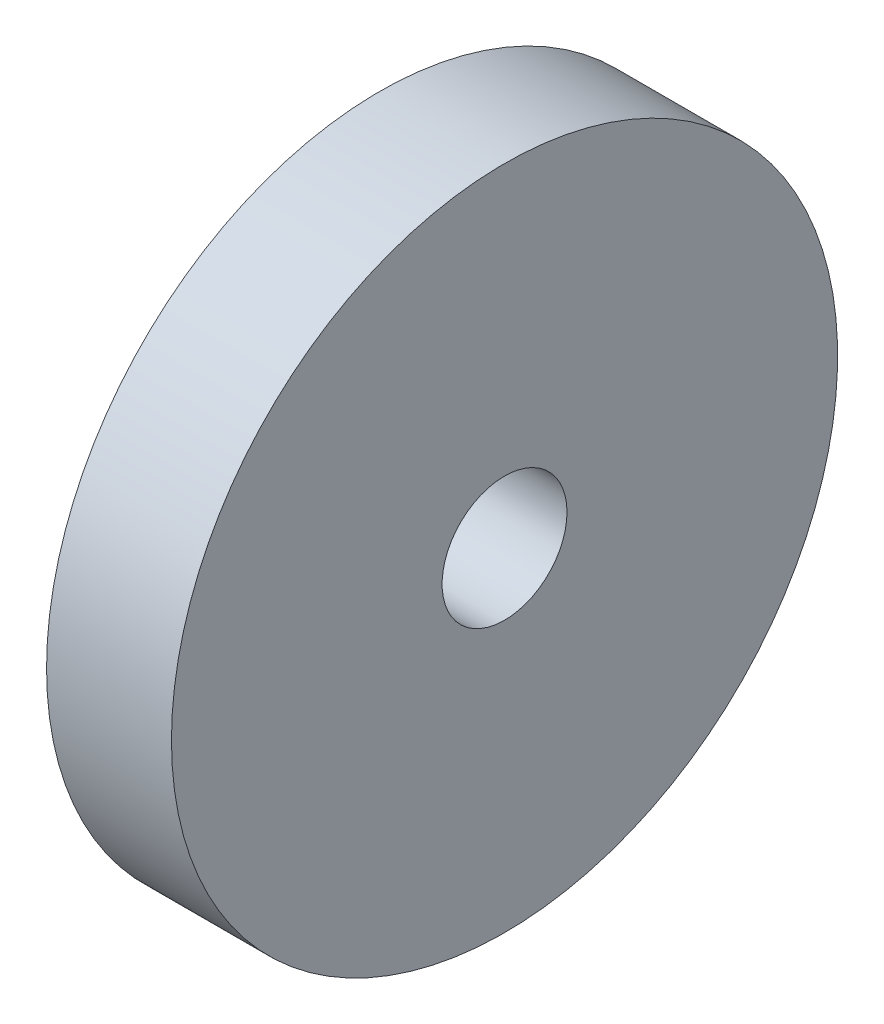
ISO-10303-21;
HEADER;
FILE_DESCRIPTION(('STEP AP214'),'2;1');
FILE_NAME('part.step','',(''),(''),'','','');
FILE_SCHEMA(('AUTOMOTIVE_DESIGN { 1 0 10303 214 1 1 1 1 }'));
ENDSEC;
DATA;
#1=APPLICATION_CONTEXT('core data for automotive mechanical design processes');
#2=APPLICATION_PROTOCOL_DEFINITION('international standard','automotive_design',2000,#1);
#3=PRODUCT_CONTEXT('',#1,'mechanical');
#4=PRODUCT('Part','Part','',(#3));
#5=PRODUCT_RELATED_PRODUCT_CATEGORY('part','',(#4));
#6=PRODUCT_DEFINITION_FORMATION('','',#4);
#7=PRODUCT_DEFINITION_CONTEXT('part definition',#1,'design');
#8=PRODUCT_DEFINITION('design','',#6,#7);
#9=PRODUCT_DEFINITION_SHAPE('','',#8);
#10=(LENGTH_UNIT() NAMED_UNIT(*) SI_UNIT(.MILLI.,.METRE.));
#11=(NAMED_UNIT(*) PLANE_ANGLE_UNIT() SI_UNIT($,.RADIAN.));
#12=(NAMED_UNIT(*) SI_UNIT($,.STERADIAN.) SOLID_ANGLE_UNIT());
#13=UNCERTAINTY_MEASURE_WITH_UNIT(LENGTH_MEASURE(1.E-05),#10,'distance_accuracy_value','');
#14=(GEOMETRIC_REPRESENTATION_CONTEXT(3) GLOBAL_UNCERTAINTY_ASSIGNED_CONTEXT((#13)) GLOBAL_UNIT_ASSIGNED_CONTEXT((#10,
#11,#12)) REPRESENTATION_CONTEXT('',''));
#15=CARTESIAN_POINT('',(0.,0.,0.));
#16=DIRECTION('',(0.,0.,1.));
#17=DIRECTION('',(1.,0.,0.));
#18=AXIS2_PLACEMENT_3D('',#15,#16,#17);
#19=CARTESIAN_POINT('',(9.525,0.,0.));
#20=DIRECTION('',(-1.,0.,0.));
#21=DIRECTION('',(0.,0.,1.));
#22=AXIS2_PLACEMENT_3D('',#19,#20,#21);
#23=CYLINDRICAL_SURFACE('',#22,12.7);
#24=CARTESIAN_POINT('',(9.525,0.,0.));
#25=DIRECTION('',(1.,0.,0.));
#26=DIRECTION('',(0.,0.,-1.));
#27=AXIS2_PLACEMENT_3D('',#24,#25,#26);
#28=CIRCLE('',#27,12.7);
#29=CARTESIAN_POINT('',(9.525,0.,12.7));
#30=VERTEX_POINT('',#29);
#31=EDGE_CURVE('E10',#30,#30,#28,.T.);
#32=CARTESIAN_POINT('',(4.7625,0.,0.));
#33=DIRECTION('',(1.,0.,0.));
#34=DIRECTION('',(0.,0.,-1.));
#35=AXIS2_PLACEMENT_3D('',#32,#33,#34);
#36=CIRCLE('',#35,12.7);
#37=CARTESIAN_POINT('',(4.7625,0.,12.7));
#38=VERTEX_POINT('',#37);
#39=EDGE_CURVE('E37',#38,#38,#36,.T.);
#40=CARTESIAN_POINT('',(9.525,0.,12.7));
#41=CARTESIAN_POINT('',(9.475390625,0.,12.7));
#42=CARTESIAN_POINT('',(9.42578125,0.,12.7));
#43=CARTESIAN_POINT('',(9.3265625,0.,12.7));
#44=CARTESIAN_POINT('',(9.276953125,0.,12.7));
#45=CARTESIAN_POINT('',(9.177734375,0.,12.7));
#46=CARTESIAN_POINT('',(9.128125,0.,12.7));
#47=CARTESIAN_POINT('',(9.02890625,0.,12.7));
#48=CARTESIAN_POINT('',(8.979296875,0.,12.7));
#49=CARTESIAN_POINT('',(8.880078125,0.,12.7));
#50=CARTESIAN_POINT('',(8.83046875,0.,12.7));
#51=CARTESIAN_POINT('',(8.73125,0.,12.7));
#52=CARTESIAN_POINT('',(8.681640625,0.,12.7));
#53=CARTESIAN_POINT('',(8.582421875,0.,12.7));
#54=CARTESIAN_POINT('',(8.5328125,0.,12.7));
#55=CARTESIAN_POINT('',(8.43359375,0.,12.7));
#56=CARTESIAN_POINT('',(8.383984375,0.,12.7));
#57=CARTESIAN_POINT('',(8.284765625,0.,12.7));
#58=CARTESIAN_POINT('',(8.23515625,0.,12.7));
#59=CARTESIAN_POINT('',(8.1359375,0.,12.7));
#60=CARTESIAN_POINT('',(8.086328125,0.,12.7));
#61=CARTESIAN_POINT('',(7.987109375,0.,12.7));
#62=CARTESIAN_POINT('',(7.9375,0.,12.7));
#63=CARTESIAN_POINT('',(7.83828125,0.,12.7));
#64=CARTESIAN_POINT('',(7.788671875,0.,12.7));
#65=CARTESIAN_POINT('',(7.689453125,0.,12.7));
#66=CARTESIAN_POINT('',(7.63984375,0.,12.7));
#67=CARTESIAN_POINT('',(7.540625,0.,12.7));
#68=CARTESIAN_POINT('',(7.491015625,0.,12.7));
#69=CARTESIAN_POINT('',(7.391796875,0.,12.7));
#70=CARTESIAN_POINT('',(7.3421875,0.,12.7));
#71=CARTESIAN_POINT('',(7.24296875,0.,12.7));
#72=CARTESIAN_POINT('',(7.193359375,0.,12.7));
#73=CARTESIAN_POINT('',(7.094140625,0.,12.7));
#74=CARTESIAN_POINT('',(7.04453125,0.,12.7));
#75=CARTESIAN_POINT('',(6.9453125,0.,12.7));
#76=CARTESIAN_POINT('',(6.895703125,0.,12.7));
#77=CARTESIAN_POINT('',(6.796484375,0.,12.7));
#78=CARTESIAN_POINT('',(6.746875,0.,12.7));
#79=CARTESIAN_POINT('',(6.64765625,0.,12.7));
#80=CARTESIAN_POINT('',(6.598046875,0.,12.7));
#81=CARTESIAN_POINT('',(6.498828125,0.,12.7));
#82=CARTESIAN_POINT('',(6.44921875,0.,12.7));
#83=CARTESIAN_POINT('',(6.35,0.,12.7));
#84=CARTESIAN_POINT('',(6.300390625,0.,12.7));
#85=CARTESIAN_POINT('',(6.201171875,0.,12.7));
#86=CARTESIAN_POINT('',(6.1515625,0.,12.7));
#87=CARTESIAN_POINT('',(6.05234375,0.,12.7));
#88=CARTESIAN_POINT('',(6.002734375,0.,12.7));
#89=CARTESIAN_POINT('',(5.903515625,0.,12.7));
#90=CARTESIAN_POINT('',(5.85390625,0.,12.7));
#91=CARTESIAN_POINT('',(5.7546875,0.,12.7));
#92=CARTESIAN_POINT('',(5.705078125,0.,12.7));
#93=CARTESIAN_POINT('',(5.605859375,0.,12.7));
#94=CARTESIAN_POINT('',(5.55625,0.,12.7));
#95=CARTESIAN_POINT('',(5.45703125,0.,12.7));
#96=CARTESIAN_POINT('',(5.407421875,0.,12.7));
#97=CARTESIAN_POINT('',(5.308203125,0.,12.7));
#98=CARTESIAN_POINT('',(5.25859375,0.,12.7));
#99=CARTESIAN_POINT('',(5.159375,0.,12.7));
#100=CARTESIAN_POINT('',(5.109765625,0.,12.7));
#101=CARTESIAN_POINT('',(5.010546875,0.,12.7));
#102=CARTESIAN_POINT('',(4.9609375,0.,12.7));
#103=CARTESIAN_POINT('',(4.86171875,0.,12.7));
#104=CARTESIAN_POINT('',(4.812109375,0.,12.7));
#105=CARTESIAN_POINT('',(4.7625,0.,12.7));
#106=B_SPLINE_CURVE_WITH_KNOTS('',3,(#40,#41,#42,#43,#44,#45,#46,#47,#48,#49,#50,#51,#52,#53,
#54,#55,#56,#57,#58,#59,#60,#61,#62,#63,#64,#65,#66,#67,#68,#69,#70,#71,#72,#73,#74,#75,#76,#77,
#78,#79,#80,#81,#82,#83,#84,#85,#86,#87,#88,#89,#90,#91,#92,#93,#94,#95,#96,#97,#98,#99,#100,
#101,#102,#103,#104,#105),.UNSPECIFIED.,.F.,.F.,(4,2,2,2,2,2,2,2,2,2,2,2,2,2,2,2,2,2,2,2,2,2,2,
2,2,2,2,2,2,2,2,2,4),(0.,0.148828124999998,0.297656249999998,0.446484374999999,
0.595312499999999,0.744140624999999,0.892968749999999,1.041796875,1.190625,1.339453125,
1.48828125,1.637109375,1.7859375,1.934765625,2.08359375,2.232421875,2.38125,2.530078125,
2.67890625,2.827734375,2.9765625,3.125390625,3.27421875,3.423046875,3.571875,3.720703125,
3.86953125,4.018359375,4.1671875,4.316015625,4.46484375,4.613671875,4.7625),.UNSPECIFIED.);
#107=EDGE_CURVE('BSEAM30',#30,#38,#106,.T.);
#108=ORIENTED_EDGE('',*,*,#31,.F.);
#109=ORIENTED_EDGE('',*,*,#39,.T.);
#110=ORIENTED_EDGE('',*,*,#107,.T.);
#111=ORIENTED_EDGE('',*,*,#107,.F.);
#112=EDGE_LOOP('',(#108,#110,#109,#111));
#113=FACE_BOUND('',#112,.T.);
#114=ADVANCED_FACE('F30',(#113),#23,.T.);
#115=CARTESIAN_POINT('',(9.525,0.,0.));
#116=DIRECTION('',(1.,0.,0.));
#117=DIRECTION('',(0.,0.,-1.));
#118=AXIS2_PLACEMENT_3D('',#115,#116,#117);
#119=PLANE('',#118);
#120=CARTESIAN_POINT('',(9.525,0.,0.));
#121=DIRECTION('',(1.,0.,0.));
#122=DIRECTION('',(0.,0.,-1.));
#123=AXIS2_PLACEMENT_3D('',#120,#121,#122);
#124=CIRCLE('',#123,2.38125);
#125=CARTESIAN_POINT('',(9.525,0.,-2.38125));
#126=VERTEX_POINT('',#125);
#127=EDGE_CURVE('E42',#126,#126,#124,.T.);
#128=ORIENTED_EDGE('',*,*,#127,.F.);
#129=EDGE_LOOP('',(#128));
#130=FACE_BOUND('',#129,.T.);
#131=ORIENTED_EDGE('',*,*,#31,.T.);
#132=EDGE_LOOP('',(#131));
#133=FACE_BOUND('',#132,.T.);
#134=ADVANCED_FACE('F59',(#130,#133),#119,.T.);
#135=CARTESIAN_POINT('',(4.7625,0.,0.));
#136=DIRECTION('',(1.,0.,0.));
#137=DIRECTION('',(0.,0.,-1.));
#138=AXIS2_PLACEMENT_3D('',#135,#136,#137);
#139=PLANE('',#138);
#140=CARTESIAN_POINT('',(4.7625,0.,0.));
#141=DIRECTION('',(1.,0.,0.));
#142=DIRECTION('',(0.,0.,-1.));
#143=AXIS2_PLACEMENT_3D('',#140,#141,#142);
#144=CIRCLE('',#143,2.38125);
#145=CARTESIAN_POINT('',(4.7625,0.,-2.38125));
#146=VERTEX_POINT('',#145);
#147=EDGE_CURVE('E33',#146,#146,#144,.T.);
#148=ORIENTED_EDGE('',*,*,#147,.T.);
#149=EDGE_LOOP('',(#148));
#150=FACE_BOUND('',#149,.T.);
#151=ORIENTED_EDGE('',*,*,#39,.F.);
#152=EDGE_LOOP('',(#151));
#153=FACE_BOUND('',#152,.T.);
#154=ADVANCED_FACE('F50',(#150,#153),#139,.F.);
#155=CARTESIAN_POINT('',(0.,0.,0.));
#156=DIRECTION('',(1.,0.,0.));
#157=DIRECTION('',(0.,0.,-1.));
#158=AXIS2_PLACEMENT_3D('',#155,#156,#157);
#159=CYLINDRICAL_SURFACE('',#158,2.38125);
#160=CARTESIAN_POINT('',(9.525,0.,-2.38125));
#161=CARTESIAN_POINT('',(9.475390625,0.,-2.38125));
#162=CARTESIAN_POINT('',(9.42578125,0.,-2.38125));
#163=CARTESIAN_POINT('',(9.3265625,0.,-2.38125));
#164=CARTESIAN_POINT('',(9.276953125,0.,-2.38125));
#165=CARTESIAN_POINT('',(9.177734375,0.,-2.38125));
#166=CARTESIAN_POINT('',(9.128125,0.,-2.38125));
#167=CARTESIAN_POINT('',(9.02890625,0.,-2.38125));
#168=CARTESIAN_POINT('',(8.979296875,0.,-2.38125));
#169=CARTESIAN_POINT('',(8.880078125,0.,-2.38125));
#170=CARTESIAN_POINT('',(8.83046875,0.,-2.38125));
#171=CARTESIAN_POINT('',(8.73125,0.,-2.38125));
#172=CARTESIAN_POINT('',(8.681640625,0.,-2.38125));
#173=CARTESIAN_POINT('',(8.582421875,0.,-2.38125));
#174=CARTESIAN_POINT('',(8.5328125,0.,-2.38125));
#175=CARTESIAN_POINT('',(8.43359375,0.,-2.38125));
#176=CARTESIAN_POINT('',(8.383984375,0.,-2.38125));
#177=CARTESIAN_POINT('',(8.284765625,0.,-2.38125));
#178=CARTESIAN_POINT('',(8.23515625,0.,-2.38125));
#179=CARTESIAN_POINT('',(8.1359375,0.,-2.38125));
#180=CARTESIAN_POINT('',(8.086328125,0.,-2.38125));
#181=CARTESIAN_POINT('',(7.987109375,0.,-2.38125));
#182=CARTESIAN_POINT('',(7.9375,0.,-2.38125));
#183=CARTESIAN_POINT('',(7.83828125,0.,-2.38125));
#184=CARTESIAN_POINT('',(7.788671875,0.,-2.38125));
#185=CARTESIAN_POINT('',(7.689453125,0.,-2.38125));
#186=CARTESIAN_POINT('',(7.63984375,0.,-2.38125));
#187=CARTESIAN_POINT('',(7.540625,0.,-2.38125));
#188=CARTESIAN_POINT('',(7.491015625,0.,-2.38125));
#189=CARTESIAN_POINT('',(7.391796875,0.,-2.38125));
#190=CARTESIAN_POINT('',(7.3421875,0.,-2.38125));
#191=CARTESIAN_POINT('',(7.24296875,0.,-2.38125));
#192=CARTESIAN_POINT('',(7.193359375,0.,-2.38125));
#193=CARTESIAN_POINT('',(7.094140625,0.,-2.38125));
#194=CARTESIAN_POINT('',(7.04453125,0.,-2.38125));
#195=CARTESIAN_POINT('',(6.9453125,0.,-2.38125));
#196=CARTESIAN_POINT('',(6.895703125,0.,-2.38125));
#197=CARTESIAN_POINT('',(6.796484375,0.,-2.38125));
#198=CARTESIAN_POINT('',(6.746875,0.,-2.38125));
#199=CARTESIAN_POINT('',(6.64765625,0.,-2.38125));
#200=CARTESIAN_POINT('',(6.598046875,0.,-2.38125));
#201=CARTESIAN_POINT('',(6.498828125,0.,-2.38125));
#202=CARTESIAN_POINT('',(6.44921875,0.,-2.38125));
#203=CARTESIAN_POINT('',(6.35,0.,-2.38125));
#204=CARTESIAN_POINT('',(6.300390625,0.,-2.38125));
#205=CARTESIAN_POINT('',(6.201171875,0.,-2.38125));
#206=CARTESIAN_POINT('',(6.1515625,0.,-2.38125));
#207=CARTESIAN_POINT('',(6.05234375,0.,-2.38125));
#208=CARTESIAN_POINT('',(6.002734375,0.,-2.38125));
#209=CARTESIAN_POINT('',(5.903515625,0.,-2.38125));
#210=CARTESIAN_POINT('',(5.85390625,0.,-2.38125));
#211=CARTESIAN_POINT('',(5.7546875,0.,-2.38125));
#212=CARTESIAN_POINT('',(5.705078125,0.,-2.38125));
#213=CARTESIAN_POINT('',(5.605859375,0.,-2.38125));
#214=CARTESIAN_POINT('',(5.55625,0.,-2.38125));
#215=CARTESIAN_POINT('',(5.45703125,0.,-2.38125));
#216=CARTESIAN_POINT('',(5.407421875,0.,-2.38125));
#217=CARTESIAN_POINT('',(5.308203125,0.,-2.38125));
#218=CARTESIAN_POINT('',(5.25859375,0.,-2.38125));
#219=CARTESIAN_POINT('',(5.159375,0.,-2.38125));
#220=CARTESIAN_POINT('',(5.109765625,0.,-2.38125));
#221=CARTESIAN_POINT('',(5.010546875,0.,-2.38125));
#222=CARTESIAN_POINT('',(4.9609375,0.,-2.38125));
#223=CARTESIAN_POINT('',(4.86171875,0.,-2.38125));
#224=CARTESIAN_POINT('',(4.812109375,0.,-2.38125));
#225=CARTESIAN_POINT('',(4.7625,0.,-2.38125));
#226=B_SPLINE_CURVE_WITH_KNOTS('',3,(#160,#161,#162,#163,#164,#165,#166,#167,#168,#169,#170,
#171,#172,#173,#174,#175,#176,#177,#178,#179,#180,#181,#182,#183,#184,#185,#186,#187,#188,#189,
#190,#191,#192,#193,#194,#195,#196,#197,#198,#199,#200,#201,#202,#203,#204,#205,#206,#207,#208,
#209,#210,#211,#212,#213,#214,#215,#216,#217,#218,#219,#220,#221,#222,#223,#224,#225),
.UNSPECIFIED.,.F.,.F.,(4,2,2,2,2,2,2,2,2,2,2,2,2,2,2,2,2,2,2,2,2,2,2,2,2,2,2,2,2,2,2,2,4),(0.,
0.148828125,0.29765625,0.446484375,0.5953125,0.744140625,0.892968750000001,1.041796875,1.190625,
1.339453125,1.48828125,1.637109375,1.7859375,1.934765625,2.08359375,2.232421875,2.38125,
2.530078125,2.67890625,2.827734375,2.9765625,3.125390625,3.27421875,3.423046875,3.571875,
3.720703125,3.86953125,4.018359375,4.1671875,4.316015625,4.46484375,4.613671875,4.7625),.UNSPECIFIED.);
#227=EDGE_CURVE('BSEAM53',#126,#146,#226,.T.);
#228=ORIENTED_EDGE('',*,*,#127,.T.);
#229=ORIENTED_EDGE('',*,*,#147,.F.);
#230=ORIENTED_EDGE('',*,*,#227,.T.);
#231=ORIENTED_EDGE('',*,*,#227,.F.);
#232=EDGE_LOOP('',(#228,#230,#229,#231));
#233=FACE_BOUND('',#232,.T.);
#234=ADVANCED_FACE('F53',(#233),#159,.F.);
#235=CLOSED_SHELL('',(#114,#134,#154,#234));
#236=MANIFOLD_SOLID_BREP('B2',#235);
#237=ADVANCED_BREP_SHAPE_REPRESENTATION('',(#18,#236),#14);
#238=SHAPE_DEFINITION_REPRESENTATION(#9,#237);
ENDSEC;
END-ISO-10303-21;
